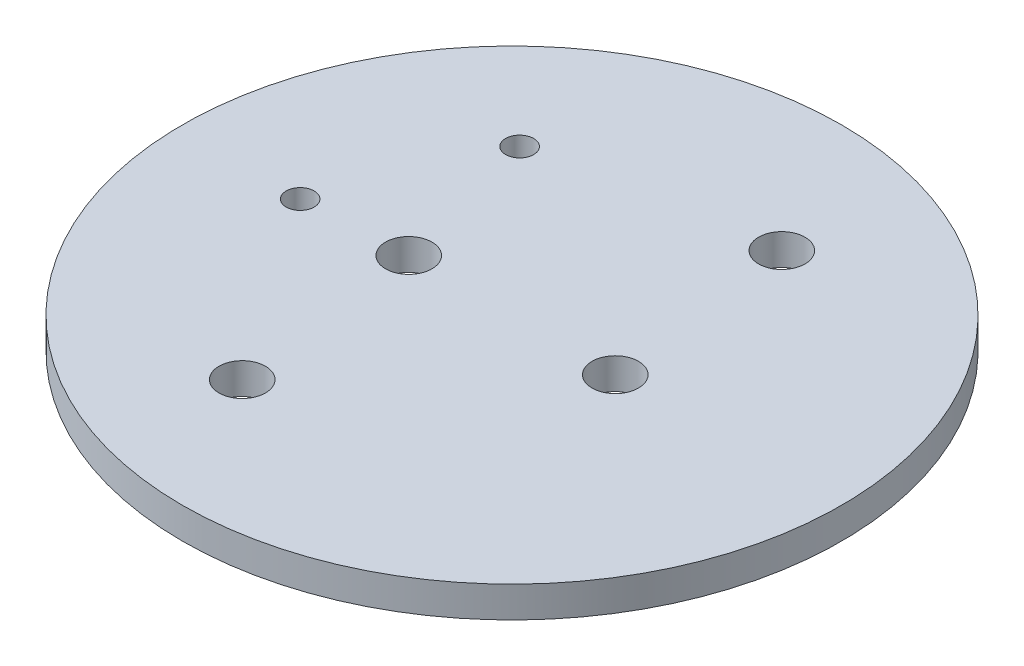
ISO-10303-21;
HEADER;
FILE_DESCRIPTION(('STEP AP214'),'2;1');
FILE_NAME('part.step','',(''),(''),'','','');
FILE_SCHEMA(('AUTOMOTIVE_DESIGN { 1 0 10303 214 1 1 1 1 }'));
ENDSEC;
DATA;
#1=APPLICATION_CONTEXT('core data for automotive mechanical design processes');
#2=APPLICATION_PROTOCOL_DEFINITION('international standard','automotive_design',2000,#1);
#3=PRODUCT_CONTEXT('',#1,'mechanical');
#4=PRODUCT('Part','Part','',(#3));
#5=PRODUCT_RELATED_PRODUCT_CATEGORY('part','',(#4));
#6=PRODUCT_DEFINITION_FORMATION('','',#4);
#7=PRODUCT_DEFINITION_CONTEXT('part definition',#1,'design');
#8=PRODUCT_DEFINITION('design','',#6,#7);
#9=PRODUCT_DEFINITION_SHAPE('','',#8);
#10=(LENGTH_UNIT() NAMED_UNIT(*) SI_UNIT(.MILLI.,.METRE.));
#11=(NAMED_UNIT(*) PLANE_ANGLE_UNIT() SI_UNIT($,.RADIAN.));
#12=(NAMED_UNIT(*) SI_UNIT($,.STERADIAN.) SOLID_ANGLE_UNIT());
#13=UNCERTAINTY_MEASURE_WITH_UNIT(LENGTH_MEASURE(1.E-05),#10,'distance_accuracy_value','');
#14=(GEOMETRIC_REPRESENTATION_CONTEXT(3) GLOBAL_UNCERTAINTY_ASSIGNED_CONTEXT((#13)) GLOBAL_UNIT_ASSIGNED_CONTEXT((#10,
#11,#12)) REPRESENTATION_CONTEXT('',''));
#15=CARTESIAN_POINT('',(0.,0.,0.));
#16=DIRECTION('',(0.,0.,1.));
#17=DIRECTION('',(1.,0.,0.));
#18=AXIS2_PLACEMENT_3D('',#15,#16,#17);
#19=CARTESIAN_POINT('',(0.,4.7752,0.));
#20=DIRECTION('',(0.,1.,0.));
#21=DIRECTION('',(0.,0.,1.));
#22=AXIS2_PLACEMENT_3D('',#19,#20,#21);
#23=PLANE('',#22);
#24=CARTESIAN_POINT('',(-21.8552577782769,4.7752,-23.03063627964));
#25=DIRECTION('',(0.,1.,0.));
#26=DIRECTION('',(0.,0.,1.));
#27=AXIS2_PLACEMENT_3D('',#24,#25,#26);
#28=CIRCLE('',#27,2.15264999999999);
#29=CARTESIAN_POINT('',(-21.8552577782769,4.7752,-20.87798627964));
#30=VERTEX_POINT('',#29);
#31=EDGE_CURVE('E67',#30,#30,#28,.T.);
#32=ORIENTED_EDGE('',*,*,#31,.F.);
#33=EDGE_LOOP('',(#32));
#34=FACE_BOUND('',#33,.T.);
#35=CARTESIAN_POINT('',(-31.739120067974,4.7752,0.831118108774998));
#36=DIRECTION('',(0.,1.,0.));
#37=DIRECTION('',(0.,0.,1.));
#38=AXIS2_PLACEMENT_3D('',#35,#36,#37);
#39=CIRCLE('',#38,2.15264999999999);
#40=CARTESIAN_POINT('',(-31.739120067974,4.7752,2.98376810877499));
#41=VERTEX_POINT('',#40);
#42=EDGE_CURVE('E56',#41,#41,#39,.T.);
#43=ORIENTED_EDGE('',*,*,#42,.F.);
#44=EDGE_LOOP('',(#43));
#45=FACE_BOUND('',#44,.T.);
#46=CARTESIAN_POINT('',(-15.875,4.7752,0.));
#47=DIRECTION('',(0.,1.,0.));
#48=DIRECTION('',(0.,0.,1.));
#49=AXIS2_PLACEMENT_3D('',#46,#47,#48);
#50=CIRCLE('',#49,3.5687);
#51=CARTESIAN_POINT('',(-15.875,4.7752,3.5687));
#52=VERTEX_POINT('',#51);
#53=EDGE_CURVE('E73',#52,#52,#50,.T.);
#54=ORIENTED_EDGE('',*,*,#53,.F.);
#55=EDGE_LOOP('',(#54));
#56=FACE_BOUND('',#55,.T.);
#57=CARTESIAN_POINT('',(12.1501989775915,4.7752,-29.3331751572334));
#58=DIRECTION('',(0.,1.,0.));
#59=DIRECTION('',(0.,0.,1.));
#60=AXIS2_PLACEMENT_3D('',#57,#58,#59);
#61=CIRCLE('',#60,3.5687);
#62=CARTESIAN_POINT('',(12.1501989775915,4.7752,-25.7644751572334));
#63=VERTEX_POINT('',#62);
#64=EDGE_CURVE('E48',#63,#63,#61,.T.);
#65=ORIENTED_EDGE('',*,*,#64,.F.);
#66=EDGE_LOOP('',(#65));
#67=FACE_BOUND('',#66,.T.);
#68=CARTESIAN_POINT('',(0.,4.7752,0.));
#69=DIRECTION('',(0.,1.,0.));
#70=DIRECTION('',(0.,0.,1.));
#71=AXIS2_PLACEMENT_3D('',#68,#69,#70);
#72=CIRCLE('',#71,50.673);
#73=CARTESIAN_POINT('',(0.,4.7752,50.673));
#74=VERTEX_POINT('',#73);
#75=EDGE_CURVE('E10',#74,#74,#72,.T.);
#76=ORIENTED_EDGE('',*,*,#75,.T.);
#77=EDGE_LOOP('',(#76));
#78=FACE_BOUND('',#77,.T.);
#79=CARTESIAN_POINT('',(-12.1501989775915,4.7752,29.3331751572334));
#80=DIRECTION('',(0.,1.,0.));
#81=DIRECTION('',(0.,0.,1.));
#82=AXIS2_PLACEMENT_3D('',#79,#80,#81);
#83=CIRCLE('',#82,3.5687);
#84=CARTESIAN_POINT('',(-12.1501989775915,4.7752,32.9018751572334));
#85=VERTEX_POINT('',#84);
#86=EDGE_CURVE('E79',#85,#85,#83,.T.);
#87=ORIENTED_EDGE('',*,*,#86,.F.);
#88=EDGE_LOOP('',(#87));
#89=FACE_BOUND('',#88,.T.);
#90=CARTESIAN_POINT('',(15.875,4.7752,0.));
#91=DIRECTION('',(0.,1.,0.));
#92=DIRECTION('',(0.,0.,1.));
#93=AXIS2_PLACEMENT_3D('',#90,#91,#92);
#94=CIRCLE('',#93,3.5687);
#95=CARTESIAN_POINT('',(15.875,4.7752,3.5687));
#96=VERTEX_POINT('',#95);
#97=EDGE_CURVE('E60',#96,#96,#94,.T.);
#98=ORIENTED_EDGE('',*,*,#97,.F.);
#99=EDGE_LOOP('',(#98));
#100=FACE_BOUND('',#99,.T.);
#101=ADVANCED_FACE('F35',(#34,#45,#56,#67,#78,#89,#100),#23,.T.);
#102=CARTESIAN_POINT('',(0.,0.,0.));
#103=DIRECTION('',(0.,1.,0.));
#104=DIRECTION('',(0.,0.,1.));
#105=AXIS2_PLACEMENT_3D('',#102,#103,#104);
#106=PLANE('',#105);
#107=CARTESIAN_POINT('',(-21.8552577782769,0.,-23.03063627964));
#108=DIRECTION('',(0.,1.,0.));
#109=DIRECTION('',(0.,0.,1.));
#110=AXIS2_PLACEMENT_3D('',#107,#108,#109);
#111=CIRCLE('',#110,2.15264999999999);
#112=CARTESIAN_POINT('',(-21.8552577782769,0.,-20.87798627964));
#113=VERTEX_POINT('',#112);
#114=EDGE_CURVE('E39',#113,#113,#111,.T.);
#115=ORIENTED_EDGE('',*,*,#114,.T.);
#116=EDGE_LOOP('',(#115));
#117=FACE_BOUND('',#116,.T.);
#118=CARTESIAN_POINT('',(-31.739120067974,0.,0.831118108774998));
#119=DIRECTION('',(0.,1.,0.));
#120=DIRECTION('',(0.,0.,1.));
#121=AXIS2_PLACEMENT_3D('',#118,#119,#120);
#122=CIRCLE('',#121,2.15264999999999);
#123=CARTESIAN_POINT('',(-31.739120067974,0.,2.98376810877499));
#124=VERTEX_POINT('',#123);
#125=EDGE_CURVE('E53',#124,#124,#122,.T.);
#126=ORIENTED_EDGE('',*,*,#125,.T.);
#127=EDGE_LOOP('',(#126));
#128=FACE_BOUND('',#127,.T.);
#129=CARTESIAN_POINT('',(0.,0.,0.));
#130=DIRECTION('',(0.,1.,0.));
#131=DIRECTION('',(0.,0.,1.));
#132=AXIS2_PLACEMENT_3D('',#129,#130,#131);
#133=CIRCLE('',#132,50.673);
#134=CARTESIAN_POINT('',(0.,0.,50.673));
#135=VERTEX_POINT('',#134);
#136=EDGE_CURVE('E43',#135,#135,#133,.T.);
#137=ORIENTED_EDGE('',*,*,#136,.F.);
#138=EDGE_LOOP('',(#137));
#139=FACE_BOUND('',#138,.T.);
#140=CARTESIAN_POINT('',(12.1501989775915,0.,-29.3331751572334));
#141=DIRECTION('',(0.,1.,0.));
#142=DIRECTION('',(0.,0.,1.));
#143=AXIS2_PLACEMENT_3D('',#140,#141,#142);
#144=CIRCLE('',#143,3.5687);
#145=CARTESIAN_POINT('',(12.1501989775915,0.,-25.7644751572334));
#146=VERTEX_POINT('',#145);
#147=EDGE_CURVE('E51',#146,#146,#144,.T.);
#148=ORIENTED_EDGE('',*,*,#147,.T.);
#149=EDGE_LOOP('',(#148));
#150=FACE_BOUND('',#149,.T.);
#151=CARTESIAN_POINT('',(-12.1501989775915,0.,29.3331751572334));
#152=DIRECTION('',(0.,1.,0.));
#153=DIRECTION('',(0.,0.,1.));
#154=AXIS2_PLACEMENT_3D('',#151,#152,#153);
#155=CIRCLE('',#154,3.5687);
#156=CARTESIAN_POINT('',(-12.1501989775915,0.,32.9018751572334));
#157=VERTEX_POINT('',#156);
#158=EDGE_CURVE('E76',#157,#157,#155,.T.);
#159=ORIENTED_EDGE('',*,*,#158,.T.);
#160=EDGE_LOOP('',(#159));
#161=FACE_BOUND('',#160,.T.);
#162=CARTESIAN_POINT('',(-15.875,0.,0.));
#163=DIRECTION('',(0.,1.,0.));
#164=DIRECTION('',(0.,0.,1.));
#165=AXIS2_PLACEMENT_3D('',#162,#163,#164);
#166=CIRCLE('',#165,3.5687);
#167=CARTESIAN_POINT('',(-15.875,0.,3.5687));
#168=VERTEX_POINT('',#167);
#169=EDGE_CURVE('E71',#168,#168,#166,.T.);
#170=ORIENTED_EDGE('',*,*,#169,.T.);
#171=EDGE_LOOP('',(#170));
#172=FACE_BOUND('',#171,.T.);
#173=CARTESIAN_POINT('',(15.875,0.,0.));
#174=DIRECTION('',(0.,1.,0.));
#175=DIRECTION('',(0.,0.,1.));
#176=AXIS2_PLACEMENT_3D('',#173,#174,#175);
#177=CIRCLE('',#176,3.5687);
#178=CARTESIAN_POINT('',(15.875,0.,3.5687));
#179=VERTEX_POINT('',#178);
#180=EDGE_CURVE('E55',#179,#179,#177,.T.);
#181=ORIENTED_EDGE('',*,*,#180,.T.);
#182=EDGE_LOOP('',(#181));
#183=FACE_BOUND('',#182,.T.);
#184=ADVANCED_FACE('F89',(#117,#128,#139,#150,#161,#172,#183),#106,.F.);
#185=CARTESIAN_POINT('',(0.,4.7752,0.));
#186=DIRECTION('',(0.,-1.,0.));
#187=DIRECTION('',(0.,0.,-1.));
#188=AXIS2_PLACEMENT_3D('',#185,#186,#187);
#189=CYLINDRICAL_SURFACE('',#188,50.673);
#190=ORIENTED_EDGE('',*,*,#75,.F.);
#191=EDGE_LOOP('',(#190));
#192=FACE_BOUND('',#191,.T.);
#193=ORIENTED_EDGE('',*,*,#136,.T.);
#194=EDGE_LOOP('',(#193));
#195=FACE_BOUND('',#194,.T.);
#196=ADVANCED_FACE('F37',(#192,#195),#189,.T.);
#197=CARTESIAN_POINT('',(12.1501989775915,4.7752,-29.3331751572334));
#198=DIRECTION('',(0.,-1.,0.));
#199=DIRECTION('',(0.,0.,-1.));
#200=AXIS2_PLACEMENT_3D('',#197,#198,#199);
#201=CYLINDRICAL_SURFACE('',#200,3.5687);
#202=ORIENTED_EDGE('',*,*,#64,.T.);
#203=EDGE_LOOP('',(#202));
#204=FACE_BOUND('',#203,.T.);
#205=ORIENTED_EDGE('',*,*,#147,.F.);
#206=EDGE_LOOP('',(#205));
#207=FACE_BOUND('',#206,.T.);
#208=ADVANCED_FACE('F92',(#204,#207),#201,.F.);
#209=CARTESIAN_POINT('',(-12.1501989775915,4.7752,29.3331751572334));
#210=DIRECTION('',(0.,-1.,0.));
#211=DIRECTION('',(0.,0.,-1.));
#212=AXIS2_PLACEMENT_3D('',#209,#210,#211);
#213=CYLINDRICAL_SURFACE('',#212,3.5687);
#214=ORIENTED_EDGE('',*,*,#86,.T.);
#215=EDGE_LOOP('',(#214));
#216=FACE_BOUND('',#215,.T.);
#217=ORIENTED_EDGE('',*,*,#158,.F.);
#218=EDGE_LOOP('',(#217));
#219=FACE_BOUND('',#218,.T.);
#220=ADVANCED_FACE('F94',(#216,#219),#213,.F.);
#221=CARTESIAN_POINT('',(-15.875,4.7752,0.));
#222=DIRECTION('',(0.,-1.,0.));
#223=DIRECTION('',(0.,0.,-1.));
#224=AXIS2_PLACEMENT_3D('',#221,#222,#223);
#225=CYLINDRICAL_SURFACE('',#224,3.5687);
#226=ORIENTED_EDGE('',*,*,#53,.T.);
#227=EDGE_LOOP('',(#226));
#228=FACE_BOUND('',#227,.T.);
#229=ORIENTED_EDGE('',*,*,#169,.F.);
#230=EDGE_LOOP('',(#229));
#231=FACE_BOUND('',#230,.T.);
#232=ADVANCED_FACE('F100',(#228,#231),#225,.F.);
#233=CARTESIAN_POINT('',(15.875,4.7752,0.));
#234=DIRECTION('',(0.,-1.,0.));
#235=DIRECTION('',(0.,0.,-1.));
#236=AXIS2_PLACEMENT_3D('',#233,#234,#235);
#237=CYLINDRICAL_SURFACE('',#236,3.5687);
#238=ORIENTED_EDGE('',*,*,#97,.T.);
#239=EDGE_LOOP('',(#238));
#240=FACE_BOUND('',#239,.T.);
#241=ORIENTED_EDGE('',*,*,#180,.F.);
#242=EDGE_LOOP('',(#241));
#243=FACE_BOUND('',#242,.T.);
#244=ADVANCED_FACE('F123',(#240,#243),#237,.F.);
#245=CARTESIAN_POINT('',(-31.739120067974,4.7752,0.831118108774998));
#246=DIRECTION('',(0.,1.,0.));
#247=DIRECTION('',(0.,0.,1.));
#248=AXIS2_PLACEMENT_3D('',#245,#246,#247);
#249=CYLINDRICAL_SURFACE('',#248,2.15264999999999);
#250=ORIENTED_EDGE('',*,*,#42,.T.);
#251=EDGE_LOOP('',(#250));
#252=FACE_BOUND('',#251,.T.);
#253=ORIENTED_EDGE('',*,*,#125,.F.);
#254=EDGE_LOOP('',(#253));
#255=FACE_BOUND('',#254,.T.);
#256=ADVANCED_FACE('F125',(#252,#255),#249,.F.);
#257=CARTESIAN_POINT('',(-21.8552577782769,4.7752,-23.03063627964));
#258=DIRECTION('',(0.,1.,0.));
#259=DIRECTION('',(0.,0.,1.));
#260=AXIS2_PLACEMENT_3D('',#257,#258,#259);
#261=CYLINDRICAL_SURFACE('',#260,2.15264999999999);
#262=ORIENTED_EDGE('',*,*,#31,.T.);
#263=EDGE_LOOP('',(#262));
#264=FACE_BOUND('',#263,.T.);
#265=ORIENTED_EDGE('',*,*,#114,.F.);
#266=EDGE_LOOP('',(#265));
#267=FACE_BOUND('',#266,.T.);
#268=ADVANCED_FACE('F133',(#264,#267),#261,.F.);
#269=CLOSED_SHELL('',(#101,#184,#196,#208,#220,#232,#244,#256,#268));
#270=MANIFOLD_SOLID_BREP('B2',#269);
#271=ADVANCED_BREP_SHAPE_REPRESENTATION('',(#18,#270),#14);
#272=SHAPE_DEFINITION_REPRESENTATION(#9,#271);
ENDSEC;
END-ISO-10303-21;
